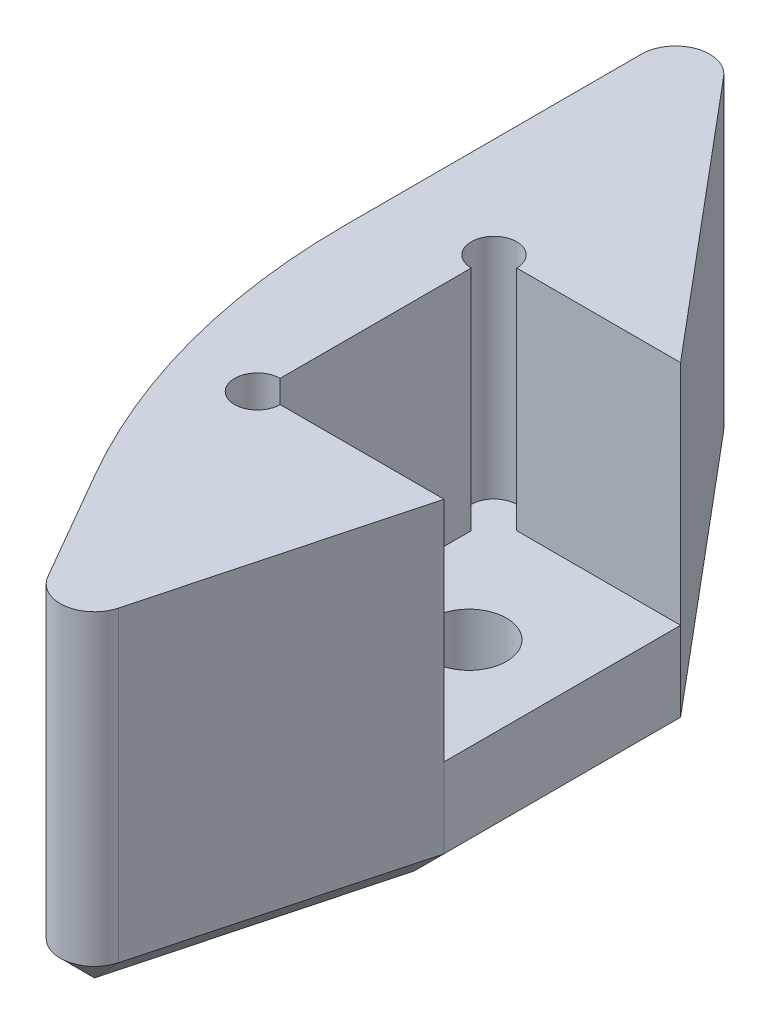
ISO-10303-21;
HEADER;
FILE_DESCRIPTION(('STEP AP214'),'2;1');
FILE_NAME('part.step','',(''),(''),'','','');
FILE_SCHEMA(('AUTOMOTIVE_DESIGN { 1 0 10303 214 1 1 1 1 }'));
ENDSEC;
DATA;
#1=APPLICATION_CONTEXT('core data for automotive mechanical design processes');
#2=APPLICATION_PROTOCOL_DEFINITION('international standard','automotive_design',2000,#1);
#3=PRODUCT_CONTEXT('',#1,'mechanical');
#4=PRODUCT('Part','Part','',(#3));
#5=PRODUCT_RELATED_PRODUCT_CATEGORY('part','',(#4));
#6=PRODUCT_DEFINITION_FORMATION('','',#4);
#7=PRODUCT_DEFINITION_CONTEXT('part definition',#1,'design');
#8=PRODUCT_DEFINITION('design','',#6,#7);
#9=PRODUCT_DEFINITION_SHAPE('','',#8);
#10=(LENGTH_UNIT() NAMED_UNIT(*) SI_UNIT(.MILLI.,.METRE.));
#11=(NAMED_UNIT(*) PLANE_ANGLE_UNIT() SI_UNIT($,.RADIAN.));
#12=(NAMED_UNIT(*) SI_UNIT($,.STERADIAN.) SOLID_ANGLE_UNIT());
#13=UNCERTAINTY_MEASURE_WITH_UNIT(LENGTH_MEASURE(1.E-05),#10,'distance_accuracy_value','');
#14=(GEOMETRIC_REPRESENTATION_CONTEXT(3) GLOBAL_UNCERTAINTY_ASSIGNED_CONTEXT((#13)) GLOBAL_UNIT_ASSIGNED_CONTEXT((#10,
#11,#12)) REPRESENTATION_CONTEXT('',''));
#15=CARTESIAN_POINT('',(0.,0.,0.));
#16=DIRECTION('',(0.,0.,1.));
#17=DIRECTION('',(1.,0.,0.));
#18=AXIS2_PLACEMENT_3D('',#15,#16,#17);
#19=CARTESIAN_POINT('',(0.,15.,0.));
#20=DIRECTION('',(0.,1.,0.));
#21=DIRECTION('',(0.,0.,1.));
#22=AXIS2_PLACEMENT_3D('',#19,#20,#21);
#23=PLANE('',#22);
#24=CARTESIAN_POINT('',(12.9,15.,-5.2));
#25=DIRECTION('',(0.,1.,0.));
#26=DIRECTION('',(0.,0.,1.));
#27=AXIS2_PLACEMENT_3D('',#24,#25,#26);
#28=CIRCLE('',#27,1.);
#29=CARTESIAN_POINT('',(13.9,15.,-5.2));
#30=VERTEX_POINT('',#29);
#31=CARTESIAN_POINT('',(12.9,15.,-4.2));
#32=VERTEX_POINT('',#31);
#33=EDGE_CURVE('E163',#30,#32,#28,.T.);
#34=ORIENTED_EDGE('',*,*,#33,.F.);
#35=DIRECTION('',(1.,0.,0.));
#36=VECTOR('',#35,1.);
#37=CARTESIAN_POINT('',(12.9,15.,-5.2));
#38=LINE('',#37,#36);
#39=CARTESIAN_POINT('',(21.1,15.,-5.2));
#40=VERTEX_POINT('',#39);
#41=EDGE_CURVE('E197',#30,#40,#38,.T.);
#42=ORIENTED_EDGE('',*,*,#41,.T.);
#43=DIRECTION('',(-0.643192086423273,0.,-0.765704864789611));
#44=VECTOR('',#43,1.);
#45=CARTESIAN_POINT('',(21.9648217636023,15.,-4.17045028142589));
#46=LINE('',#45,#44);
#47=CARTESIAN_POINT('',(11.1485572971844,15.,-17.04695559859));
#48=VERTEX_POINT('',#47);
#49=EDGE_CURVE('E200',#40,#48,#46,.T.);
#50=ORIENTED_EDGE('',*,*,#49,.T.);
#51=CARTESIAN_POINT('',(10.,15.,-16.0821674689551));
#52=DIRECTION('',(0.,-1.,0.));
#53=DIRECTION('',(0.,0.,1.));
#54=AXIS2_PLACEMENT_3D('',#51,#52,#53);
#55=CIRCLE('',#54,1.5);
#56=CARTESIAN_POINT('',(8.5,15.,-16.0821674689551));
#57=VERTEX_POINT('',#56);
#58=EDGE_CURVE('E249',#57,#48,#55,.T.);
#59=ORIENTED_EDGE('',*,*,#58,.F.);
#60=DIRECTION('',(0.,0.,-1.));
#61=VECTOR('',#60,1.);
#62=CARTESIAN_POINT('',(8.5,15.,-20.2));
#63=LINE('',#62,#61);
#64=CARTESIAN_POINT('',(8.50000000000001,15.,-3.03847577293368));
#65=VERTEX_POINT('',#64);
#66=EDGE_CURVE('E318',#65,#57,#63,.T.);
#67=ORIENTED_EDGE('',*,*,#66,.F.);
#68=CARTESIAN_POINT('',(38.5,15.,-3.03847577293369));
#69=DIRECTION('',(0.,-1.,0.));
#70=DIRECTION('',(0.,0.,1.));
#71=AXIS2_PLACEMENT_3D('',#68,#69,#70);
#72=CIRCLE('',#71,30.);
#73=CARTESIAN_POINT('',(12.5192378864669,15.,11.9615242270663));
#74=VERTEX_POINT('',#73);
#75=EDGE_CURVE('E237',#74,#65,#72,.T.);
#76=ORIENTED_EDGE('',*,*,#75,.F.);
#77=DIRECTION('',(0.500000000000001,0.,0.866025403784438));
#78=VECTOR('',#77,1.);
#79=CARTESIAN_POINT('',(8.45993649053891,15.,4.93060796608388));
#80=LINE('',#79,#78);
#81=CARTESIAN_POINT('',(15.3454024618169,15.,16.856584862124));
#82=VERTEX_POINT('',#81);
#83=EDGE_CURVE('E209',#74,#82,#80,.T.);
#84=ORIENTED_EDGE('',*,*,#83,.T.);
#85=CARTESIAN_POINT('',(16.6444405674936,15.,16.106584862124));
#86=DIRECTION('',(0.,-1.,0.));
#87=DIRECTION('',(0.,0.,1.));
#88=AXIS2_PLACEMENT_3D('',#85,#86,#87);
#89=CIRCLE('',#88,1.5);
#90=CARTESIAN_POINT('',(18.0939615901187,15.,16.4924459834717));
#91=VERTEX_POINT('',#90);
#92=EDGE_CURVE('E252',#91,#82,#89,.T.);
#93=ORIENTED_EDGE('',*,*,#92,.F.);
#94=DIRECTION('',(0.257240747565183,0.,-0.966347348416762));
#95=VECTOR('',#94,1.);
#96=CARTESIAN_POINT('',(22.1213278653823,15.,1.36329262016992));
#97=LINE('',#96,#95);
#98=CARTESIAN_POINT('',(21.1,15.,5.2));
#99=VERTEX_POINT('',#98);
#100=EDGE_CURVE('E204',#91,#99,#97,.T.);
#101=ORIENTED_EDGE('',*,*,#100,.T.);
#102=DIRECTION('',(-1.,0.,0.));
#103=VECTOR('',#102,1.);
#104=CARTESIAN_POINT('',(12.9,15.,5.2));
#105=LINE('',#104,#103);
#106=CARTESIAN_POINT('',(13.9,15.,5.2));
#107=VERTEX_POINT('',#106);
#108=EDGE_CURVE('E191',#99,#107,#105,.T.);
#109=ORIENTED_EDGE('',*,*,#108,.T.);
#110=CARTESIAN_POINT('',(12.9,15.,5.2));
#111=DIRECTION('',(0.,1.,0.));
#112=DIRECTION('',(0.,0.,1.));
#113=AXIS2_PLACEMENT_3D('',#110,#111,#112);
#114=CIRCLE('',#113,1.);
#115=CARTESIAN_POINT('',(12.9,15.,4.2));
#116=VERTEX_POINT('',#115);
#117=EDGE_CURVE('E164',#116,#107,#114,.T.);
#118=ORIENTED_EDGE('',*,*,#117,.F.);
#119=DIRECTION('',(0.,0.,-1.));
#120=VECTOR('',#119,1.);
#121=CARTESIAN_POINT('',(12.9,15.,5.2));
#122=LINE('',#121,#120);
#123=EDGE_CURVE('E173',#116,#32,#122,.T.);
#124=ORIENTED_EDGE('',*,*,#123,.T.);
#125=EDGE_LOOP('',(#34,#42,#50,#59,#67,#76,#84,#93,#101,#109,#118,#124));
#126=FACE_BOUND('',#125,.T.);
#127=ADVANCED_FACE('F43',(#126),#23,.T.);
#128=CARTESIAN_POINT('',(21.1,15.,0.));
#129=DIRECTION('',(1.,0.,0.));
#130=DIRECTION('',(0.,0.,1.));
#131=AXIS2_PLACEMENT_3D('',#128,#129,#130);
#132=PLANE('',#131);
#133=DIRECTION('',(0.,-1.,0.));
#134=VECTOR('',#133,1.);
#135=CARTESIAN_POINT('',(21.1,15.,-5.2));
#136=LINE('',#135,#134);
#137=CARTESIAN_POINT('',(21.1,5.,-5.2));
#138=VERTEX_POINT('',#137);
#139=CARTESIAN_POINT('',(21.1,1.50000000000001,-5.2));
#140=VERTEX_POINT('',#139);
#141=EDGE_CURVE('E221',#138,#140,#136,.T.);
#142=ORIENTED_EDGE('',*,*,#141,.F.);
#143=DIRECTION('',(0.,0.,1.));
#144=VECTOR('',#143,1.);
#145=CARTESIAN_POINT('',(21.1,5.,5.2));
#146=LINE('',#145,#144);
#147=CARTESIAN_POINT('',(21.1,5.,5.2));
#148=VERTEX_POINT('',#147);
#149=EDGE_CURVE('E187',#138,#148,#146,.T.);
#150=ORIENTED_EDGE('',*,*,#149,.T.);
#151=DIRECTION('',(0.,-1.,0.));
#152=VECTOR('',#151,1.);
#153=CARTESIAN_POINT('',(21.1,15.,5.2));
#154=LINE('',#153,#152);
#155=CARTESIAN_POINT('',(21.1,1.50000000000001,5.2));
#156=VERTEX_POINT('',#155);
#157=EDGE_CURVE('E213',#148,#156,#154,.T.);
#158=ORIENTED_EDGE('',*,*,#157,.T.);
#159=DIRECTION('',(0.,0.,1.));
#160=VECTOR('',#159,1.);
#161=CARTESIAN_POINT('',(21.1,1.50000000000001,5.2));
#162=LINE('',#161,#160);
#163=EDGE_CURVE('E299',#140,#156,#162,.T.);
#164=ORIENTED_EDGE('',*,*,#163,.F.);
#165=EDGE_LOOP('',(#142,#150,#158,#164));
#166=FACE_BOUND('',#165,.T.);
#167=ADVANCED_FACE('F368',(#166),#132,.T.);
#168=CARTESIAN_POINT('',(17.,15.,0.));
#169=DIRECTION('',(0.,-1.,0.));
#170=DIRECTION('',(0.,0.,-1.));
#171=AXIS2_PLACEMENT_3D('',#168,#169,#170);
#172=CYLINDRICAL_SURFACE('',#171,1.65);
#173=CARTESIAN_POINT('',(17.,0.,0.));
#174=DIRECTION('',(0.,-1.,0.));
#175=DIRECTION('',(0.,0.,1.));
#176=AXIS2_PLACEMENT_3D('',#173,#174,#175);
#177=CIRCLE('',#176,1.65);
#178=CARTESIAN_POINT('',(17.,0.,1.65));
#179=VERTEX_POINT('',#178);
#180=EDGE_CURVE('E205',#179,#179,#177,.T.);
#181=ORIENTED_EDGE('',*,*,#180,.T.);
#182=EDGE_LOOP('',(#181));
#183=FACE_BOUND('',#182,.T.);
#184=CARTESIAN_POINT('',(17.,5.,0.));
#185=DIRECTION('',(0.,-1.,0.));
#186=DIRECTION('',(0.,0.,1.));
#187=AXIS2_PLACEMENT_3D('',#184,#185,#186);
#188=CIRCLE('',#187,1.65);
#189=CARTESIAN_POINT('',(17.,5.,1.65));
#190=VERTEX_POINT('',#189);
#191=EDGE_CURVE('E185',#190,#190,#188,.T.);
#192=ORIENTED_EDGE('',*,*,#191,.F.);
#193=EDGE_LOOP('',(#192));
#194=FACE_BOUND('',#193,.T.);
#195=ADVANCED_FACE('F440',(#183,#194),#172,.F.);
#196=CARTESIAN_POINT('',(21.9648217636023,15.,-4.17045028142589));
#197=DIRECTION('',(0.765704864789611,0.,-0.643192086423273));
#198=DIRECTION('',(0.643192086423273,0.,0.765704864789611));
#199=AXIS2_PLACEMENT_3D('',#196,#197,#198);
#200=PLANE('',#199);
#201=DIRECTION('',(0.,-1.,0.));
#202=VECTOR('',#201,1.);
#203=CARTESIAN_POINT('',(11.1485572971844,15.,-17.04695559859));
#204=LINE('',#203,#202);
#205=CARTESIAN_POINT('',(11.1485572971844,1.50000000000001,-17.04695559859));
#206=VERTEX_POINT('',#205);
#207=EDGE_CURVE('E255',#48,#206,#204,.T.);
#208=ORIENTED_EDGE('',*,*,#207,.F.);
#209=ORIENTED_EDGE('',*,*,#49,.F.);
#210=EDGE_CURVE('E222',#40,#138,#136,.T.);
#211=ORIENTED_EDGE('',*,*,#210,.T.);
#212=ORIENTED_EDGE('',*,*,#141,.T.);
#213=DIRECTION('',(0.643192086423273,0.,0.765704864789611));
#214=VECTOR('',#213,1.);
#215=CARTESIAN_POINT('',(21.1,1.50000000000001,-5.2));
#216=LINE('',#215,#214);
#217=EDGE_CURVE('E303',#206,#140,#216,.T.);
#218=ORIENTED_EDGE('',*,*,#217,.F.);
#219=EDGE_LOOP('',(#208,#209,#211,#212,#218));
#220=FACE_BOUND('',#219,.T.);
#221=ADVANCED_FACE('F352',(#220),#200,.T.);
#222=CARTESIAN_POINT('',(22.1213278653823,15.,1.36329262016992));
#223=DIRECTION('',(0.966347348416762,0.,0.257240747565183));
#224=DIRECTION('',(-0.257240747565183,0.,0.966347348416762));
#225=AXIS2_PLACEMENT_3D('',#222,#223,#224);
#226=PLANE('',#225);
#227=ORIENTED_EDGE('',*,*,#157,.F.);
#228=EDGE_CURVE('E217',#99,#148,#154,.T.);
#229=ORIENTED_EDGE('',*,*,#228,.F.);
#230=ORIENTED_EDGE('',*,*,#100,.F.);
#231=DIRECTION('',(0.,-1.,0.));
#232=VECTOR('',#231,1.);
#233=CARTESIAN_POINT('',(18.0939615901187,15.,16.4924459834717));
#234=LINE('',#233,#232);
#235=CARTESIAN_POINT('',(18.0939615901187,1.50000000000001,16.4924459834717));
#236=VERTEX_POINT('',#235);
#237=EDGE_CURVE('E245',#236,#91,#234,.F.);
#238=ORIENTED_EDGE('',*,*,#237,.F.);
#239=DIRECTION('',(-0.257240747565183,0.,0.966347348416762));
#240=VECTOR('',#239,1.);
#241=CARTESIAN_POINT('',(18.0939615901187,1.50000000000001,16.4924459834717));
#242=LINE('',#241,#240);
#243=EDGE_CURVE('E295',#156,#236,#242,.T.);
#244=ORIENTED_EDGE('',*,*,#243,.F.);
#245=EDGE_LOOP('',(#227,#229,#230,#238,#244));
#246=FACE_BOUND('',#245,.T.);
#247=ADVANCED_FACE('F375',(#246),#226,.T.);
#248=CARTESIAN_POINT('',(8.45993649053891,15.,4.93060796608388));
#249=DIRECTION('',(-0.866025403784438,0.,0.500000000000001));
#250=DIRECTION('',(-0.500000000000001,0.,-0.866025403784438));
#251=AXIS2_PLACEMENT_3D('',#248,#249,#250);
#252=PLANE('',#251);
#253=DIRECTION('',(0.,-1.,0.));
#254=VECTOR('',#253,1.);
#255=CARTESIAN_POINT('',(15.3454024618169,15.,16.856584862124));
#256=LINE('',#255,#254);
#257=CARTESIAN_POINT('',(15.3454024618169,1.50000000000001,16.856584862124));
#258=VERTEX_POINT('',#257);
#259=EDGE_CURVE('E241',#82,#258,#256,.T.);
#260=ORIENTED_EDGE('',*,*,#259,.F.);
#261=ORIENTED_EDGE('',*,*,#83,.F.);
#262=DIRECTION('',(0.,-1.,0.));
#263=VECTOR('',#262,1.);
#264=CARTESIAN_POINT('',(12.5192378864669,15.,11.9615242270663));
#265=LINE('',#264,#263);
#266=CARTESIAN_POINT('',(12.5192378864669,1.50000000000001,11.9615242270663));
#267=VERTEX_POINT('',#266);
#268=EDGE_CURVE('E233',#267,#74,#265,.F.);
#269=ORIENTED_EDGE('',*,*,#268,.F.);
#270=DIRECTION('',(-0.500000000000001,0.,-0.866025403784438));
#271=VECTOR('',#270,1.);
#272=CARTESIAN_POINT('',(12.5192378864669,1.50000000000001,11.9615242270663));
#273=LINE('',#272,#271);
#274=EDGE_CURVE('E287',#258,#267,#273,.T.);
#275=ORIENTED_EDGE('',*,*,#274,.F.);
#276=EDGE_LOOP('',(#260,#261,#269,#275));
#277=FACE_BOUND('',#276,.T.);
#278=ADVANCED_FACE('F422',(#277),#252,.T.);
#279=CARTESIAN_POINT('',(17.,0.,0.));
#280=DIRECTION('',(0.,1.,0.));
#281=DIRECTION('',(0.,0.,1.));
#282=AXIS2_PLACEMENT_3D('',#279,#280,#281);
#283=PLANE('',#282);
#284=CARTESIAN_POINT('',(38.5,0.,-3.03847577293369));
#285=DIRECTION('',(0.,-1.,0.));
#286=DIRECTION('',(0.,0.,1.));
#287=AXIS2_PLACEMENT_3D('',#284,#285,#286);
#288=CIRCLE('',#287,28.5);
#289=CARTESIAN_POINT('',(10.,0.,-3.03847577293369));
#290=VERTEX_POINT('',#289);
#291=CARTESIAN_POINT('',(13.8182759921435,0.,11.2115242270663));
#292=VERTEX_POINT('',#291);
#293=EDGE_CURVE('E267',#290,#292,#288,.F.);
#294=ORIENTED_EDGE('',*,*,#293,.F.);
#295=DIRECTION('',(0.,0.,1.));
#296=VECTOR('',#295,1.);
#297=CARTESIAN_POINT('',(10.,0.,-3.03847577293369));
#298=LINE('',#297,#296);
#299=CARTESIAN_POINT('',(10.,0.,-16.0821674689551));
#300=VERTEX_POINT('',#299);
#301=EDGE_CURVE('E263',#300,#290,#298,.T.);
#302=ORIENTED_EDGE('',*,*,#301,.F.);
#303=DIRECTION('',(-0.643192086423273,0.,-0.765704864789611));
#304=VECTOR('',#303,1.);
#305=CARTESIAN_POINT('',(10.,0.,-16.0821674689551));
#306=LINE('',#305,#304);
#307=CARTESIAN_POINT('',(19.6,0.,-4.65359604038364));
#308=VERTEX_POINT('',#307);
#309=EDGE_CURVE('E271',#308,#300,#306,.T.);
#310=ORIENTED_EDGE('',*,*,#309,.F.);
#311=DIRECTION('',(0.,0.,-1.));
#312=VECTOR('',#311,1.);
#313=CARTESIAN_POINT('',(19.6,0.,-5.2));
#314=LINE('',#313,#312);
#315=CARTESIAN_POINT('',(19.6,0.,5.00376756850286));
#316=VERTEX_POINT('',#315);
#317=EDGE_CURVE('E275',#316,#308,#314,.T.);
#318=ORIENTED_EDGE('',*,*,#317,.F.);
#319=DIRECTION('',(0.257240747565183,0.,-0.966347348416762));
#320=VECTOR('',#319,1.);
#321=CARTESIAN_POINT('',(19.6504789773749,0.,4.81413887865222));
#322=LINE('',#321,#320);
#323=CARTESIAN_POINT('',(16.6444405674936,0.,16.106584862124));
#324=VERTEX_POINT('',#323);
#325=EDGE_CURVE('E279',#324,#316,#322,.T.);
#326=ORIENTED_EDGE('',*,*,#325,.F.);
#327=DIRECTION('',(0.500000000000001,0.,0.866025403784438));
#328=VECTOR('',#327,1.);
#329=CARTESIAN_POINT('',(16.6444405674936,0.,16.106584862124));
#330=LINE('',#329,#328);
#331=EDGE_CURVE('E283',#292,#324,#330,.T.);
#332=ORIENTED_EDGE('',*,*,#331,.F.);
#333=EDGE_LOOP('',(#294,#302,#310,#318,#326,#332));
#334=FACE_BOUND('',#333,.T.);
#335=ORIENTED_EDGE('',*,*,#180,.F.);
#336=EDGE_LOOP('',(#335));
#337=FACE_BOUND('',#336,.T.);
#338=ADVANCED_FACE('F385',(#334,#337),#283,.F.);
#339=CARTESIAN_POINT('',(12.9,5.,-5.2));
#340=DIRECTION('',(0.,0.,-1.));
#341=DIRECTION('',(1.,0.,0.));
#342=AXIS2_PLACEMENT_3D('',#339,#340,#341);
#343=PLANE('',#342);
#344=ORIENTED_EDGE('',*,*,#41,.F.);
#345=DIRECTION('',(0.,1.,0.));
#346=VECTOR('',#345,1.);
#347=CARTESIAN_POINT('',(13.9,2.17157287525381,-5.2));
#348=LINE('',#347,#346);
#349=CARTESIAN_POINT('',(13.9,5.,-5.2));
#350=VERTEX_POINT('',#349);
#351=EDGE_CURVE('E393',#30,#350,#348,.F.);
#352=ORIENTED_EDGE('',*,*,#351,.T.);
#353=DIRECTION('',(1.,0.,0.));
#354=VECTOR('',#353,1.);
#355=CARTESIAN_POINT('',(12.9,5.,-5.2));
#356=LINE('',#355,#354);
#357=EDGE_CURVE('E180',#350,#138,#356,.T.);
#358=ORIENTED_EDGE('',*,*,#357,.T.);
#359=ORIENTED_EDGE('',*,*,#210,.F.);
#360=EDGE_LOOP('',(#344,#352,#358,#359));
#361=FACE_BOUND('',#360,.T.);
#362=ADVANCED_FACE('F578',(#361),#343,.F.);
#363=CARTESIAN_POINT('',(12.9,5.,5.2));
#364=DIRECTION('',(-1.,0.,0.));
#365=DIRECTION('',(0.,0.,-1.));
#366=AXIS2_PLACEMENT_3D('',#363,#364,#365);
#367=PLANE('',#366);
#368=DIRECTION('',(0.,0.,-1.));
#369=VECTOR('',#368,1.);
#370=CARTESIAN_POINT('',(12.9,5.,5.2));
#371=LINE('',#370,#369);
#372=CARTESIAN_POINT('',(12.9,5.,4.2));
#373=VERTEX_POINT('',#372);
#374=CARTESIAN_POINT('',(12.9,5.,-4.2));
#375=VERTEX_POINT('',#374);
#376=EDGE_CURVE('E171',#373,#375,#371,.T.);
#377=ORIENTED_EDGE('',*,*,#376,.T.);
#378=DIRECTION('',(0.,1.,0.));
#379=VECTOR('',#378,1.);
#380=CARTESIAN_POINT('',(12.9,2.17157287525381,-4.2));
#381=LINE('',#380,#379);
#382=EDGE_CURVE('E175',#375,#32,#381,.T.);
#383=ORIENTED_EDGE('',*,*,#382,.T.);
#384=ORIENTED_EDGE('',*,*,#123,.F.);
#385=DIRECTION('',(0.,1.,0.));
#386=VECTOR('',#385,1.);
#387=CARTESIAN_POINT('',(12.9,2.17157287525381,4.2));
#388=LINE('',#387,#386);
#389=EDGE_CURVE('E157',#116,#373,#388,.F.);
#390=ORIENTED_EDGE('',*,*,#389,.T.);
#391=EDGE_LOOP('',(#377,#383,#384,#390));
#392=FACE_BOUND('',#391,.T.);
#393=ADVANCED_FACE('F169',(#392),#367,.F.);
#394=CARTESIAN_POINT('',(12.9,5.,5.2));
#395=DIRECTION('',(0.,0.,1.));
#396=DIRECTION('',(-1.,0.,0.));
#397=AXIS2_PLACEMENT_3D('',#394,#395,#396);
#398=PLANE('',#397);
#399=DIRECTION('',(-1.,0.,0.));
#400=VECTOR('',#399,1.);
#401=CARTESIAN_POINT('',(12.9,5.,5.2));
#402=LINE('',#401,#400);
#403=CARTESIAN_POINT('',(13.9,5.,5.2));
#404=VERTEX_POINT('',#403);
#405=EDGE_CURVE('E181',#148,#404,#402,.T.);
#406=ORIENTED_EDGE('',*,*,#405,.T.);
#407=DIRECTION('',(0.,1.,0.));
#408=VECTOR('',#407,1.);
#409=CARTESIAN_POINT('',(13.9,2.17157287525381,5.2));
#410=LINE('',#409,#408);
#411=EDGE_CURVE('E160',#404,#107,#410,.T.);
#412=ORIENTED_EDGE('',*,*,#411,.T.);
#413=ORIENTED_EDGE('',*,*,#108,.F.);
#414=ORIENTED_EDGE('',*,*,#228,.T.);
#415=EDGE_LOOP('',(#406,#412,#413,#414));
#416=FACE_BOUND('',#415,.T.);
#417=ADVANCED_FACE('F411',(#416),#398,.F.);
#418=CARTESIAN_POINT('',(17.,5.,0.));
#419=DIRECTION('',(0.,1.,0.));
#420=DIRECTION('',(0.,0.,1.));
#421=AXIS2_PLACEMENT_3D('',#418,#419,#420);
#422=PLANE('',#421);
#423=ORIENTED_EDGE('',*,*,#357,.F.);
#424=CARTESIAN_POINT('',(12.9,5.,-5.2));
#425=DIRECTION('',(0.,1.,0.));
#426=DIRECTION('',(0.,0.,1.));
#427=AXIS2_PLACEMENT_3D('',#424,#425,#426);
#428=CIRCLE('',#427,1.);
#429=EDGE_CURVE('E66',#375,#350,#428,.F.);
#430=ORIENTED_EDGE('',*,*,#429,.F.);
#431=ORIENTED_EDGE('',*,*,#376,.F.);
#432=CARTESIAN_POINT('',(12.9,5.,5.2));
#433=DIRECTION('',(0.,1.,0.));
#434=DIRECTION('',(0.,0.,1.));
#435=AXIS2_PLACEMENT_3D('',#432,#433,#434);
#436=CIRCLE('',#435,1.);
#437=EDGE_CURVE('E60',#404,#373,#436,.F.);
#438=ORIENTED_EDGE('',*,*,#437,.F.);
#439=ORIENTED_EDGE('',*,*,#405,.F.);
#440=ORIENTED_EDGE('',*,*,#149,.F.);
#441=EDGE_LOOP('',(#423,#430,#431,#438,#439,#440));
#442=FACE_BOUND('',#441,.T.);
#443=ORIENTED_EDGE('',*,*,#191,.T.);
#444=EDGE_LOOP('',(#443));
#445=FACE_BOUND('',#444,.T.);
#446=ADVANCED_FACE('F177',(#442,#445),#422,.T.);
#447=CARTESIAN_POINT('',(38.5,15.,-3.03847577293369));
#448=DIRECTION('',(0.,-1.,0.));
#449=DIRECTION('',(0.,0.,-1.));
#450=AXIS2_PLACEMENT_3D('',#447,#448,#449);
#451=CYLINDRICAL_SURFACE('',#450,30.);
#452=ORIENTED_EDGE('',*,*,#268,.T.);
#453=ORIENTED_EDGE('',*,*,#75,.T.);
#454=DIRECTION('',(0.,-1.,0.));
#455=VECTOR('',#454,1.);
#456=CARTESIAN_POINT('',(8.5,15.,-3.03847577293369));
#457=LINE('',#456,#455);
#458=CARTESIAN_POINT('',(8.50000000000001,1.50000000000001,-3.03847577293369));
#459=VERTEX_POINT('',#458);
#460=EDGE_CURVE('E226',#65,#459,#457,.T.);
#461=ORIENTED_EDGE('',*,*,#460,.T.);
#462=CARTESIAN_POINT('',(38.5,1.50000000000001,-3.03847577293369));
#463=DIRECTION('',(0.,-1.,0.));
#464=DIRECTION('',(0.,0.,1.));
#465=AXIS2_PLACEMENT_3D('',#462,#463,#464);
#466=CIRCLE('',#465,30.);
#467=EDGE_CURVE('E52',#267,#459,#466,.T.);
#468=ORIENTED_EDGE('',*,*,#467,.F.);
#469=EDGE_LOOP('',(#452,#453,#461,#468));
#470=FACE_BOUND('',#469,.T.);
#471=ADVANCED_FACE('F452',(#470),#451,.T.);
#472=CARTESIAN_POINT('',(16.6444405674936,15.,16.106584862124));
#473=DIRECTION('',(0.,-1.,0.));
#474=DIRECTION('',(0.,0.,-1.));
#475=AXIS2_PLACEMENT_3D('',#472,#473,#474);
#476=CYLINDRICAL_SURFACE('',#475,1.5);
#477=ORIENTED_EDGE('',*,*,#237,.T.);
#478=ORIENTED_EDGE('',*,*,#92,.T.);
#479=ORIENTED_EDGE('',*,*,#259,.T.);
#480=CARTESIAN_POINT('',(16.6444405674936,1.50000000000001,16.106584862124));
#481=DIRECTION('',(0.,-1.,0.));
#482=DIRECTION('',(0.,0.,1.));
#483=AXIS2_PLACEMENT_3D('',#480,#481,#482);
#484=CIRCLE('',#483,1.5);
#485=EDGE_CURVE('E291',#236,#258,#484,.T.);
#486=ORIENTED_EDGE('',*,*,#485,.F.);
#487=EDGE_LOOP('',(#477,#478,#479,#486));
#488=FACE_BOUND('',#487,.T.);
#489=ADVANCED_FACE('F416',(#488),#476,.T.);
#490=CARTESIAN_POINT('',(10.,15.,-16.0821674689551));
#491=DIRECTION('',(0.,-1.,0.));
#492=DIRECTION('',(0.,0.,-1.));
#493=AXIS2_PLACEMENT_3D('',#490,#491,#492);
#494=CYLINDRICAL_SURFACE('',#493,1.5);
#495=DIRECTION('',(0.,-1.,0.));
#496=VECTOR('',#495,1.);
#497=CARTESIAN_POINT('',(8.50000000000001,15.,-16.0821674689551));
#498=LINE('',#497,#496);
#499=CARTESIAN_POINT('',(8.50000000000001,1.50000000000001,-16.0821674689551));
#500=VERTEX_POINT('',#499);
#501=EDGE_CURVE('E259',#500,#57,#498,.F.);
#502=ORIENTED_EDGE('',*,*,#501,.T.);
#503=ORIENTED_EDGE('',*,*,#58,.T.);
#504=ORIENTED_EDGE('',*,*,#207,.T.);
#505=CARTESIAN_POINT('',(10.,1.50000000000001,-16.0821674689551));
#506=DIRECTION('',(0.,-1.,0.));
#507=DIRECTION('',(0.,0.,1.));
#508=AXIS2_PLACEMENT_3D('',#505,#506,#507);
#509=CIRCLE('',#508,1.5);
#510=EDGE_CURVE('E307',#500,#206,#509,.T.);
#511=ORIENTED_EDGE('',*,*,#510,.F.);
#512=EDGE_LOOP('',(#502,#503,#504,#511));
#513=FACE_BOUND('',#512,.T.);
#514=ADVANCED_FACE('F355',(#513),#494,.T.);
#515=CARTESIAN_POINT('',(20.8162644664178,0.,-3.20566215179098));
#516=DIRECTION('',(0.541435102280263,-0.707106781186546,-0.454805485915421));
#517=DIRECTION('',(0.643192086423273,0.,0.765704864789611));
#518=AXIS2_PLACEMENT_3D('',#515,#516,#517);
#519=PLANE('',#518);
#520=DIRECTION('',(0.684756111540818,0.68475611154082,-0.249435633811601));
#521=VECTOR('',#520,1.);
#522=CARTESIAN_POINT('',(19.9229845434225,0.322984543422469,-4.77124939599759));
#523=LINE('',#522,#521);
#524=EDGE_CURVE('E335',#140,#308,#523,.F.);
#525=ORIENTED_EDGE('',*,*,#524,.T.);
#526=ORIENTED_EDGE('',*,*,#309,.T.);
#527=DIRECTION('',(0.541435102280261,0.707106781186549,-0.45480548591542));
#528=VECTOR('',#527,1.);
#529=CARTESIAN_POINT('',(10.,0.,-16.0821674689551));
#530=LINE('',#529,#528);
#531=EDGE_CURVE('E46',#300,#206,#530,.T.);
#532=ORIENTED_EDGE('',*,*,#531,.T.);
#533=ORIENTED_EDGE('',*,*,#217,.T.);
#534=EDGE_LOOP('',(#525,#526,#532,#533));
#535=FACE_BOUND('',#534,.T.);
#536=ADVANCED_FACE('F340',(#535),#519,.T.);
#537=CARTESIAN_POINT('',(10.,1.50000000000001,-16.0821674689551));
#538=DIRECTION('',(0.,1.,0.));
#539=DIRECTION('',(0.,0.,1.));
#540=AXIS2_PLACEMENT_3D('',#537,#538,#539);
#541=CONICAL_SURFACE('',#540,1.50000000000001,0.785398163397447);
#542=ORIENTED_EDGE('',*,*,#531,.F.);
#543=DIRECTION('',(-0.707106781186546,0.707106781186549,0.));
#544=VECTOR('',#543,1.);
#545=CARTESIAN_POINT('',(10.,0.,-16.0821674689551));
#546=LINE('',#545,#544);
#547=EDGE_CURVE('E332',#300,#500,#546,.T.);
#548=ORIENTED_EDGE('',*,*,#547,.T.);
#549=ORIENTED_EDGE('',*,*,#510,.T.);
#550=EDGE_LOOP('',(#542,#548,#549));
#551=FACE_BOUND('',#550,.T.);
#552=ADVANCED_FACE('F347',(#551),#541,.T.);
#553=CARTESIAN_POINT('',(19.6,0.,0.));
#554=DIRECTION('',(0.707106781186548,-0.707106781186547,0.));
#555=DIRECTION('',(0.,0.,1.));
#556=AXIS2_PLACEMENT_3D('',#553,#554,#555);
#557=PLANE('',#556);
#558=ORIENTED_EDGE('',*,*,#524,.F.);
#559=ORIENTED_EDGE('',*,*,#163,.T.);
#560=DIRECTION('',(0.704100651628404,0.704100651628405,0.0921115885918424));
#561=VECTOR('',#560,1.);
#562=CARTESIAN_POINT('',(19.2754765034691,-0.324523496530858,4.96131287863472));
#563=LINE('',#562,#561);
#564=EDGE_CURVE('E329',#156,#316,#563,.F.);
#565=ORIENTED_EDGE('',*,*,#564,.T.);
#566=ORIENTED_EDGE('',*,*,#317,.T.);
#567=EDGE_LOOP('',(#558,#559,#565,#566));
#568=FACE_BOUND('',#567,.T.);
#569=ADVANCED_FACE('F380',(#568),#557,.T.);
#570=CARTESIAN_POINT('',(10.,0.,0.));
#571=DIRECTION('',(-0.707106781186548,-0.707106781186547,0.));
#572=DIRECTION('',(0.,0.,-1.));
#573=AXIS2_PLACEMENT_3D('',#570,#571,#572);
#574=PLANE('',#573);
#575=ORIENTED_EDGE('',*,*,#547,.F.);
#576=ORIENTED_EDGE('',*,*,#301,.T.);
#577=DIRECTION('',(-0.707106781186547,0.707106781186548,0.));
#578=VECTOR('',#577,1.);
#579=CARTESIAN_POINT('',(10.,0.,-3.03847577293369));
#580=LINE('',#579,#578);
#581=EDGE_CURVE('E325',#290,#459,#580,.T.);
#582=ORIENTED_EDGE('',*,*,#581,.T.);
#583=DIRECTION('',(0.,0.,-1.));
#584=VECTOR('',#583,1.);
#585=CARTESIAN_POINT('',(8.50000000000001,1.50000000000001,-16.0821674689551));
#586=LINE('',#585,#584);
#587=EDGE_CURVE('E11',#459,#500,#586,.T.);
#588=ORIENTED_EDGE('',*,*,#587,.T.);
#589=EDGE_LOOP('',(#575,#576,#582,#588));
#590=FACE_BOUND('',#589,.T.);
#591=ADVANCED_FACE('F389',(#590),#574,.T.);
#592=CARTESIAN_POINT('',(20.6718068427572,0.,0.977431498822147));
#593=DIRECTION('',(0.683310763047132,-0.707106781186547,0.181896677000838));
#594=DIRECTION('',(-0.257240747565183,0.,0.966347348416762));
#595=AXIS2_PLACEMENT_3D('',#592,#593,#594);
#596=PLANE('',#595);
#597=ORIENTED_EDGE('',*,*,#564,.F.);
#598=ORIENTED_EDGE('',*,*,#243,.T.);
#599=DIRECTION('',(-0.683310763047131,-0.707106781186548,-0.181896677000838));
#600=VECTOR('',#599,1.);
#601=CARTESIAN_POINT('',(18.0939615901187,1.50000000000001,16.4924459834717));
#602=LINE('',#601,#600);
#603=EDGE_CURVE('E321',#236,#324,#602,.T.);
#604=ORIENTED_EDGE('',*,*,#603,.T.);
#605=ORIENTED_EDGE('',*,*,#325,.T.);
#606=EDGE_LOOP('',(#597,#598,#604,#605));
#607=FACE_BOUND('',#606,.T.);
#608=ADVANCED_FACE('F425',(#607),#596,.T.);
#609=CARTESIAN_POINT('',(38.5,0.,-3.03847577293369));
#610=DIRECTION('',(0.,1.,0.));
#611=DIRECTION('',(0.,0.,1.));
#612=AXIS2_PLACEMENT_3D('',#609,#610,#611);
#613=CONICAL_SURFACE('',#612,28.5,0.785398163397447);
#614=ORIENTED_EDGE('',*,*,#581,.F.);
#615=ORIENTED_EDGE('',*,*,#293,.T.);
#616=DIRECTION('',(-0.612372435695794,0.707106781186548,0.353553390593275));
#617=VECTOR('',#616,1.);
#618=CARTESIAN_POINT('',(13.8182759921435,0.,11.2115242270663));
#619=LINE('',#618,#617);
#620=EDGE_CURVE('E317',#292,#267,#619,.T.);
#621=ORIENTED_EDGE('',*,*,#620,.T.);
#622=ORIENTED_EDGE('',*,*,#467,.T.);
#623=EDGE_LOOP('',(#614,#615,#621,#622));
#624=FACE_BOUND('',#623,.T.);
#625=ADVANCED_FACE('F427',(#624),#613,.T.);
#626=CARTESIAN_POINT('',(16.6444405674936,1.50000000000001,16.106584862124));
#627=DIRECTION('',(0.,1.,0.));
#628=DIRECTION('',(0.,0.,1.));
#629=AXIS2_PLACEMENT_3D('',#626,#627,#628);
#630=CONICAL_SURFACE('',#629,1.50000000000001,0.785398163397447);
#631=ORIENTED_EDGE('',*,*,#485,.T.);
#632=DIRECTION('',(0.612372435695793,-0.707106781186548,-0.353553390593273));
#633=VECTOR('',#632,1.);
#634=CARTESIAN_POINT('',(15.3454024618169,1.50000000000001,16.856584862124));
#635=LINE('',#634,#633);
#636=EDGE_CURVE('E314',#258,#324,#635,.T.);
#637=ORIENTED_EDGE('',*,*,#636,.T.);
#638=ORIENTED_EDGE('',*,*,#603,.F.);
#639=EDGE_LOOP('',(#631,#637,#638));
#640=FACE_BOUND('',#639,.T.);
#641=ADVANCED_FACE('F419',(#640),#630,.T.);
#642=CARTESIAN_POINT('',(9.75897459621558,0.,4.18060796608387));
#643=DIRECTION('',(-0.612372435695795,-0.707106781186546,0.353553390593275));
#644=DIRECTION('',(-0.500000000000001,0.,-0.866025403784438));
#645=AXIS2_PLACEMENT_3D('',#642,#643,#644);
#646=PLANE('',#645);
#647=ORIENTED_EDGE('',*,*,#620,.F.);
#648=ORIENTED_EDGE('',*,*,#331,.T.);
#649=ORIENTED_EDGE('',*,*,#636,.F.);
#650=ORIENTED_EDGE('',*,*,#274,.T.);
#651=EDGE_LOOP('',(#647,#648,#649,#650));
#652=FACE_BOUND('',#651,.T.);
#653=ADVANCED_FACE('F424',(#652),#646,.T.);
#654=CARTESIAN_POINT('',(8.5,0.,-20.2));
#655=DIRECTION('',(1.,0.,0.));
#656=DIRECTION('',(0.,0.,-1.));
#657=AXIS2_PLACEMENT_3D('',#654,#655,#656);
#658=PLANE('',#657);
#659=ORIENTED_EDGE('',*,*,#460,.F.);
#660=ORIENTED_EDGE('',*,*,#66,.T.);
#661=ORIENTED_EDGE('',*,*,#501,.F.);
#662=ORIENTED_EDGE('',*,*,#587,.F.);
#663=EDGE_LOOP('',(#659,#660,#661,#662));
#664=FACE_BOUND('',#663,.T.);
#665=ADVANCED_FACE('F391',(#664),#658,.F.);
#666=CARTESIAN_POINT('',(12.9,2.17157287525381,5.2));
#667=DIRECTION('',(0.,1.,0.));
#668=DIRECTION('',(0.,0.,1.));
#669=AXIS2_PLACEMENT_3D('',#666,#667,#668);
#670=CYLINDRICAL_SURFACE('',#669,1.);
#671=ORIENTED_EDGE('',*,*,#117,.T.);
#672=ORIENTED_EDGE('',*,*,#411,.F.);
#673=ORIENTED_EDGE('',*,*,#437,.T.);
#674=ORIENTED_EDGE('',*,*,#389,.F.);
#675=EDGE_LOOP('',(#671,#672,#673,#674));
#676=FACE_BOUND('',#675,.T.);
#677=ADVANCED_FACE('F156',(#676),#670,.F.);
#678=CARTESIAN_POINT('',(12.9,2.17157287525381,-5.2));
#679=DIRECTION('',(0.,1.,0.));
#680=DIRECTION('',(0.,0.,1.));
#681=AXIS2_PLACEMENT_3D('',#678,#679,#680);
#682=CYLINDRICAL_SURFACE('',#681,1.);
#683=ORIENTED_EDGE('',*,*,#33,.T.);
#684=ORIENTED_EDGE('',*,*,#382,.F.);
#685=ORIENTED_EDGE('',*,*,#429,.T.);
#686=ORIENTED_EDGE('',*,*,#351,.F.);
#687=EDGE_LOOP('',(#683,#684,#685,#686));
#688=FACE_BOUND('',#687,.T.);
#689=ADVANCED_FACE('F409',(#688),#682,.F.);
#690=CLOSED_SHELL('',(#127,#167,#195,#221,#247,#278,#338,#362,#393,#417,#446,#471,#489,#514,
#536,#552,#569,#591,#608,#625,#641,#653,#665,#677,#689));
#691=MANIFOLD_SOLID_BREP('B2',#690);
#692=ADVANCED_BREP_SHAPE_REPRESENTATION('',(#18,#691),#14);
#693=SHAPE_DEFINITION_REPRESENTATION(#9,#692);
ENDSEC;
END-ISO-10303-21;
